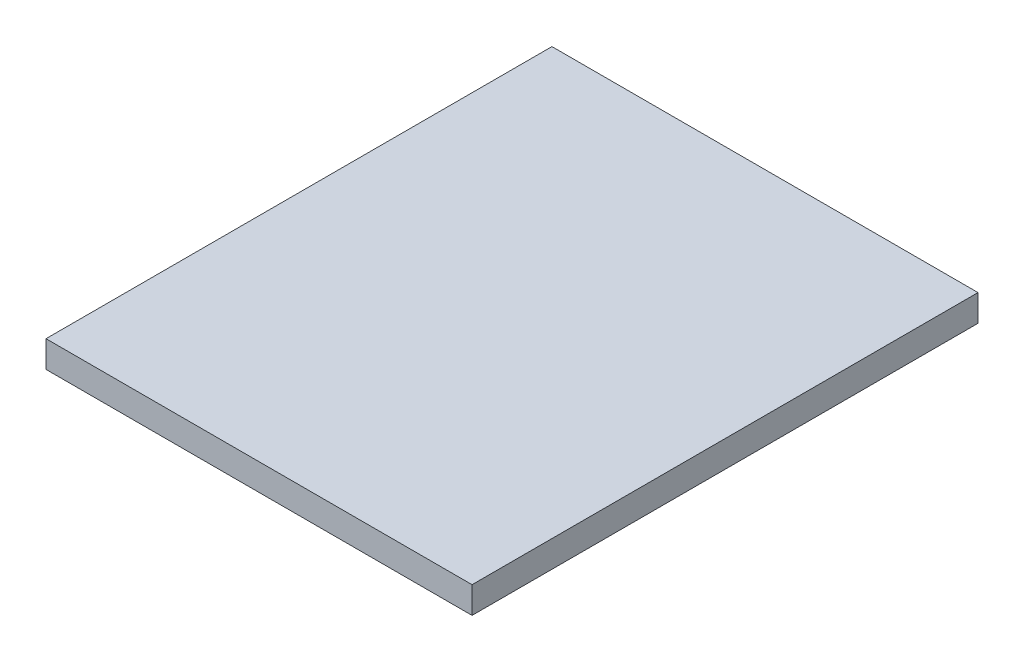
ISO-10303-21;
HEADER;
FILE_DESCRIPTION(('STEP AP214'),'2;1');
FILE_NAME('part.step','',(''),(''),'','','');
FILE_SCHEMA(('AUTOMOTIVE_DESIGN { 1 0 10303 214 1 1 1 1 }'));
ENDSEC;
DATA;
#1=APPLICATION_CONTEXT('core data for automotive mechanical design processes');
#2=APPLICATION_PROTOCOL_DEFINITION('international standard','automotive_design',2000,#1);
#3=PRODUCT_CONTEXT('',#1,'mechanical');
#4=PRODUCT('Part','Part','',(#3));
#5=PRODUCT_RELATED_PRODUCT_CATEGORY('part','',(#4));
#6=PRODUCT_DEFINITION_FORMATION('','',#4);
#7=PRODUCT_DEFINITION_CONTEXT('part definition',#1,'design');
#8=PRODUCT_DEFINITION('design','',#6,#7);
#9=PRODUCT_DEFINITION_SHAPE('','',#8);
#10=(LENGTH_UNIT() NAMED_UNIT(*) SI_UNIT(.MILLI.,.METRE.));
#11=(NAMED_UNIT(*) PLANE_ANGLE_UNIT() SI_UNIT($,.RADIAN.));
#12=(NAMED_UNIT(*) SI_UNIT($,.STERADIAN.) SOLID_ANGLE_UNIT());
#13=UNCERTAINTY_MEASURE_WITH_UNIT(LENGTH_MEASURE(1.E-05),#10,'distance_accuracy_value','');
#14=(GEOMETRIC_REPRESENTATION_CONTEXT(3) GLOBAL_UNCERTAINTY_ASSIGNED_CONTEXT((#13)) GLOBAL_UNIT_ASSIGNED_CONTEXT((#10,
#11,#12)) REPRESENTATION_CONTEXT('',''));
#15=CARTESIAN_POINT('',(0.,0.,0.));
#16=DIRECTION('',(0.,0.,1.));
#17=DIRECTION('',(1.,0.,0.));
#18=AXIS2_PLACEMENT_3D('',#15,#16,#17);
#19=CARTESIAN_POINT('',(25.4,3.175,30.1625));
#20=DIRECTION('',(-1.,0.,0.));
#21=DIRECTION('',(0.,0.,-1.));
#22=AXIS2_PLACEMENT_3D('',#19,#20,#21);
#23=PLANE('',#22);
#24=DIRECTION('',(0.,0.,1.));
#25=VECTOR('',#24,1.);
#26=CARTESIAN_POINT('',(25.4,0.,30.1625));
#27=LINE('',#26,#25);
#28=CARTESIAN_POINT('',(25.4,0.,-30.1625));
#29=VERTEX_POINT('',#28);
#30=CARTESIAN_POINT('',(25.4,0.,30.1625));
#31=VERTEX_POINT('',#30);
#32=EDGE_CURVE('E106',#29,#31,#27,.T.);
#33=ORIENTED_EDGE('',*,*,#32,.F.);
#34=DIRECTION('',(0.,-1.,0.));
#35=VECTOR('',#34,1.);
#36=CARTESIAN_POINT('',(25.4,3.175,-30.1625));
#37=LINE('',#36,#35);
#38=CARTESIAN_POINT('',(25.4,3.175,-30.1625));
#39=VERTEX_POINT('',#38);
#40=EDGE_CURVE('E105',#39,#29,#37,.T.);
#41=ORIENTED_EDGE('',*,*,#40,.F.);
#42=DIRECTION('',(0.,0.,1.));
#43=VECTOR('',#42,1.);
#44=CARTESIAN_POINT('',(25.4,3.175,30.1625));
#45=LINE('',#44,#43);
#46=CARTESIAN_POINT('',(25.4,3.175,30.1625));
#47=VERTEX_POINT('',#46);
#48=EDGE_CURVE('E100',#39,#47,#45,.T.);
#49=ORIENTED_EDGE('',*,*,#48,.T.);
#50=DIRECTION('',(0.,-1.,0.));
#51=VECTOR('',#50,1.);
#52=CARTESIAN_POINT('',(25.4,3.175,30.1625));
#53=LINE('',#52,#51);
#54=EDGE_CURVE('E11',#47,#31,#53,.T.);
#55=ORIENTED_EDGE('',*,*,#54,.T.);
#56=EDGE_LOOP('',(#33,#41,#49,#55));
#57=FACE_BOUND('',#56,.T.);
#58=ADVANCED_FACE('F43',(#57),#23,.F.);
#59=CARTESIAN_POINT('',(-25.4,3.175,30.1625));
#60=DIRECTION('',(0.,0.,-1.));
#61=DIRECTION('',(1.,0.,0.));
#62=AXIS2_PLACEMENT_3D('',#59,#60,#61);
#63=PLANE('',#62);
#64=DIRECTION('',(-1.,0.,0.));
#65=VECTOR('',#64,1.);
#66=CARTESIAN_POINT('',(-25.4,0.,30.1625));
#67=LINE('',#66,#65);
#68=CARTESIAN_POINT('',(-25.4,0.,30.1625));
#69=VERTEX_POINT('',#68);
#70=EDGE_CURVE('E108',#31,#69,#67,.T.);
#71=ORIENTED_EDGE('',*,*,#70,.F.);
#72=ORIENTED_EDGE('',*,*,#54,.F.);
#73=DIRECTION('',(-1.,0.,0.));
#74=VECTOR('',#73,1.);
#75=CARTESIAN_POINT('',(-25.4,3.175,30.1625));
#76=LINE('',#75,#74);
#77=CARTESIAN_POINT('',(-25.4,3.175,30.1625));
#78=VERTEX_POINT('',#77);
#79=EDGE_CURVE('E84',#47,#78,#76,.T.);
#80=ORIENTED_EDGE('',*,*,#79,.T.);
#81=DIRECTION('',(0.,-1.,0.));
#82=VECTOR('',#81,1.);
#83=CARTESIAN_POINT('',(-25.4,3.175,30.1625));
#84=LINE('',#83,#82);
#85=EDGE_CURVE('E51',#78,#69,#84,.T.);
#86=ORIENTED_EDGE('',*,*,#85,.T.);
#87=EDGE_LOOP('',(#71,#72,#80,#86));
#88=FACE_BOUND('',#87,.T.);
#89=ADVANCED_FACE('F98',(#88),#63,.F.);
#90=CARTESIAN_POINT('',(-25.4,3.175,30.1625));
#91=DIRECTION('',(1.,0.,0.));
#92=DIRECTION('',(0.,0.,1.));
#93=AXIS2_PLACEMENT_3D('',#90,#91,#92);
#94=PLANE('',#93);
#95=DIRECTION('',(0.,0.,-1.));
#96=VECTOR('',#95,1.);
#97=CARTESIAN_POINT('',(-25.4,0.,30.1625));
#98=LINE('',#97,#96);
#99=CARTESIAN_POINT('',(-25.4,0.,-30.1625));
#100=VERTEX_POINT('',#99);
#101=EDGE_CURVE('E94',#69,#100,#98,.T.);
#102=ORIENTED_EDGE('',*,*,#101,.F.);
#103=ORIENTED_EDGE('',*,*,#85,.F.);
#104=DIRECTION('',(0.,0.,-1.));
#105=VECTOR('',#104,1.);
#106=CARTESIAN_POINT('',(-25.4,3.175,30.1625));
#107=LINE('',#106,#105);
#108=CARTESIAN_POINT('',(-25.4,3.175,-30.1625));
#109=VERTEX_POINT('',#108);
#110=EDGE_CURVE('E87',#78,#109,#107,.T.);
#111=ORIENTED_EDGE('',*,*,#110,.T.);
#112=DIRECTION('',(0.,-1.,0.));
#113=VECTOR('',#112,1.);
#114=CARTESIAN_POINT('',(-25.4,3.175,-30.1625));
#115=LINE('',#114,#113);
#116=EDGE_CURVE('E97',#109,#100,#115,.T.);
#117=ORIENTED_EDGE('',*,*,#116,.T.);
#118=EDGE_LOOP('',(#102,#103,#111,#117));
#119=FACE_BOUND('',#118,.T.);
#120=ADVANCED_FACE('F93',(#119),#94,.F.);
#121=CARTESIAN_POINT('',(-25.4,3.175,-30.1625));
#122=DIRECTION('',(0.,0.,1.));
#123=DIRECTION('',(-1.,0.,0.));
#124=AXIS2_PLACEMENT_3D('',#121,#122,#123);
#125=PLANE('',#124);
#126=DIRECTION('',(1.,0.,0.));
#127=VECTOR('',#126,1.);
#128=CARTESIAN_POINT('',(-25.4,0.,-30.1625));
#129=LINE('',#128,#127);
#130=EDGE_CURVE('E73',#100,#29,#129,.T.);
#131=ORIENTED_EDGE('',*,*,#130,.F.);
#132=ORIENTED_EDGE('',*,*,#116,.F.);
#133=DIRECTION('',(1.,0.,0.));
#134=VECTOR('',#133,1.);
#135=CARTESIAN_POINT('',(-25.4,3.175,-30.1625));
#136=LINE('',#135,#134);
#137=EDGE_CURVE('E59',#109,#39,#136,.T.);
#138=ORIENTED_EDGE('',*,*,#137,.T.);
#139=ORIENTED_EDGE('',*,*,#40,.T.);
#140=EDGE_LOOP('',(#131,#132,#138,#139));
#141=FACE_BOUND('',#140,.T.);
#142=ADVANCED_FACE('F117',(#141),#125,.F.);
#143=CARTESIAN_POINT('',(0.,3.175,0.));
#144=DIRECTION('',(0.,1.,0.));
#145=DIRECTION('',(0.,0.,-1.));
#146=AXIS2_PLACEMENT_3D('',#143,#144,#145);
#147=PLANE('',#146);
#148=ORIENTED_EDGE('',*,*,#48,.F.);
#149=ORIENTED_EDGE('',*,*,#137,.F.);
#150=ORIENTED_EDGE('',*,*,#110,.F.);
#151=ORIENTED_EDGE('',*,*,#79,.F.);
#152=EDGE_LOOP('',(#148,#149,#150,#151));
#153=FACE_BOUND('',#152,.T.);
#154=ADVANCED_FACE('F89',(#153),#147,.T.);
#155=CARTESIAN_POINT('',(0.,0.,0.));
#156=DIRECTION('',(0.,1.,0.));
#157=DIRECTION('',(0.,0.,-1.));
#158=AXIS2_PLACEMENT_3D('',#155,#156,#157);
#159=PLANE('',#158);
#160=ORIENTED_EDGE('',*,*,#32,.T.);
#161=ORIENTED_EDGE('',*,*,#70,.T.);
#162=ORIENTED_EDGE('',*,*,#101,.T.);
#163=ORIENTED_EDGE('',*,*,#130,.T.);
#164=EDGE_LOOP('',(#160,#161,#162,#163));
#165=FACE_BOUND('',#164,.T.);
#166=ADVANCED_FACE('F113',(#165),#159,.F.);
#167=CLOSED_SHELL('',(#58,#89,#120,#142,#154,#166));
#168=MANIFOLD_SOLID_BREP('B2',#167);
#169=ADVANCED_BREP_SHAPE_REPRESENTATION('',(#18,#168),#14);
#170=SHAPE_DEFINITION_REPRESENTATION(#9,#169);
ENDSEC;
END-ISO-10303-21;
